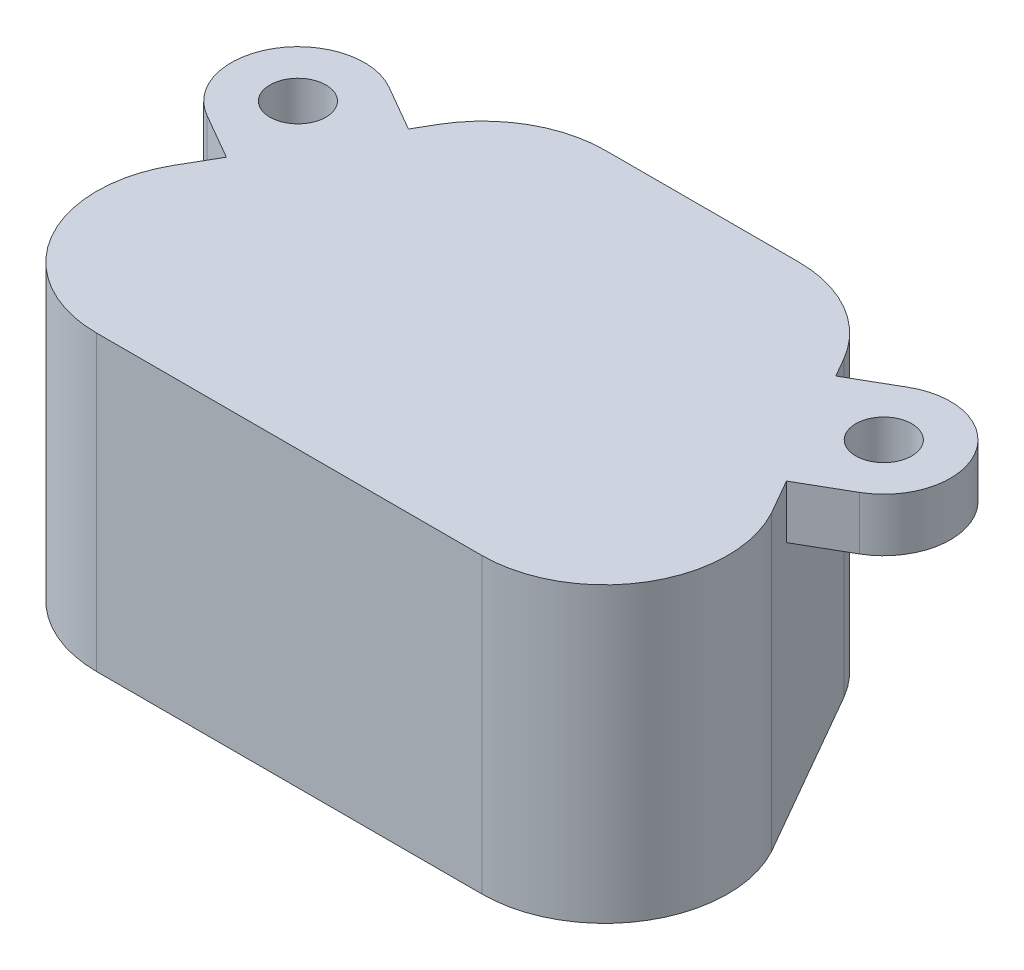
ISO-10303-21;
HEADER;
FILE_DESCRIPTION(('STEP AP214'),'2;1');
FILE_NAME('part.step','',(''),(''),'','','');
FILE_SCHEMA(('AUTOMOTIVE_DESIGN { 1 0 10303 214 1 1 1 1 }'));
ENDSEC;
DATA;
#1=APPLICATION_CONTEXT('core data for automotive mechanical design processes');
#2=APPLICATION_PROTOCOL_DEFINITION('international standard','automotive_design',2000,#1);
#3=PRODUCT_CONTEXT('',#1,'mechanical');
#4=PRODUCT('Part','Part','',(#3));
#5=PRODUCT_RELATED_PRODUCT_CATEGORY('part','',(#4));
#6=PRODUCT_DEFINITION_FORMATION('','',#4);
#7=PRODUCT_DEFINITION_CONTEXT('part definition',#1,'design');
#8=PRODUCT_DEFINITION('design','',#6,#7);
#9=PRODUCT_DEFINITION_SHAPE('','',#8);
#10=(LENGTH_UNIT() NAMED_UNIT(*) SI_UNIT(.MILLI.,.METRE.));
#11=(NAMED_UNIT(*) PLANE_ANGLE_UNIT() SI_UNIT($,.RADIAN.));
#12=(NAMED_UNIT(*) SI_UNIT($,.STERADIAN.) SOLID_ANGLE_UNIT());
#13=UNCERTAINTY_MEASURE_WITH_UNIT(LENGTH_MEASURE(1.E-05),#10,'distance_accuracy_value','');
#14=(GEOMETRIC_REPRESENTATION_CONTEXT(3) GLOBAL_UNCERTAINTY_ASSIGNED_CONTEXT((#13)) GLOBAL_UNIT_ASSIGNED_CONTEXT((#10,
#11,#12)) REPRESENTATION_CONTEXT('',''));
#15=CARTESIAN_POINT('',(0.,0.,0.));
#16=DIRECTION('',(0.,0.,1.));
#17=DIRECTION('',(1.,0.,0.));
#18=AXIS2_PLACEMENT_3D('',#15,#16,#17);
#19=CARTESIAN_POINT('',(-47.4216966637043,0.,0.730165567187122));
#20=DIRECTION('',(0.,1.,0.));
#21=DIRECTION('',(0.,0.,1.));
#22=AXIS2_PLACEMENT_3D('',#19,#20,#21);
#23=PLANE('',#22);
#24=CARTESIAN_POINT('',(-47.4216966637043,0.,0.730165567187122));
#25=DIRECTION('',(0.,1.,0.));
#26=DIRECTION('',(0.,0.,1.));
#27=AXIS2_PLACEMENT_3D('',#24,#25,#26);
#28=CIRCLE('',#27,9.22333333333335);
#29=CARTESIAN_POINT('',(-47.4216966637043,0.,-8.49316776614623));
#30=VERTEX_POINT('',#29);
#31=CARTESIAN_POINT('',(-55.3489808309486,0.,-3.98449704105281));
#32=VERTEX_POINT('',#31);
#33=EDGE_CURVE('E357',#30,#32,#28,.T.);
#34=ORIENTED_EDGE('',*,*,#33,.F.);
#35=DIRECTION('',(-1.,0.,0.));
#36=VECTOR('',#35,1.);
#37=CARTESIAN_POINT('',(-47.4216966637043,0.,-8.49316776614623));
#38=LINE('',#37,#36);
#39=CARTESIAN_POINT('',(-32.9216966637043,0.,-8.49316776614623));
#40=VERTEX_POINT('',#39);
#41=EDGE_CURVE('E372',#40,#30,#38,.T.);
#42=ORIENTED_EDGE('',*,*,#41,.F.);
#43=CARTESIAN_POINT('',(-32.9216966637043,0.,0.730165567187122));
#44=DIRECTION('',(0.,1.,0.));
#45=DIRECTION('',(0.,0.,-1.));
#46=AXIS2_PLACEMENT_3D('',#43,#44,#45);
#47=CIRCLE('',#46,9.22333333333335);
#48=CARTESIAN_POINT('',(-24.9330360805528,0.,-3.87973463400808));
#49=VERTEX_POINT('',#48);
#50=EDGE_CURVE('E370',#49,#40,#47,.T.);
#51=ORIENTED_EDGE('',*,*,#50,.F.);
#52=DIRECTION('',(-0.497445549195721,0.,-0.867495202053226));
#53=VECTOR('',#52,1.);
#54=CARTESIAN_POINT('',(-24.9330360805528,0.,-3.87973463400808));
#55=LINE('',#54,#53);
#56=CARTESIAN_POINT('',(-17.6364011451582,0.,8.84486569224452));
#57=VERTEX_POINT('',#56);
#58=EDGE_CURVE('E368',#57,#49,#55,.T.);
#59=ORIENTED_EDGE('',*,*,#58,.F.);
#60=CARTESIAN_POINT('',(-25.7453956916071,0.,13.2396450067768));
#61=DIRECTION('',(0.,1.,0.));
#62=DIRECTION('',(0.,0.,-1.));
#63=AXIS2_PLACEMENT_3D('',#60,#61,#62);
#64=CIRCLE('',#63,9.22333333333335);
#65=CARTESIAN_POINT('',(-25.7453956916071,0.,22.4629783401101));
#66=VERTEX_POINT('',#65);
#67=EDGE_CURVE('E366',#66,#57,#64,.T.);
#68=ORIENTED_EDGE('',*,*,#67,.F.);
#69=DIRECTION('',(1.,0.,0.));
#70=VECTOR('',#69,1.);
#71=CARTESIAN_POINT('',(-54.6453956916071,0.,22.4629783401101));
#72=LINE('',#71,#70);
#73=CARTESIAN_POINT('',(-54.6453956916071,0.,22.4629783401101));
#74=VERTEX_POINT('',#73);
#75=EDGE_CURVE('E364',#74,#66,#72,.T.);
#76=ORIENTED_EDGE('',*,*,#75,.F.);
#77=CARTESIAN_POINT('',(-54.6453956916071,0.,13.2396450067768));
#78=DIRECTION('',(0.,1.,0.));
#79=DIRECTION('',(0.,0.,1.));
#80=AXIS2_PLACEMENT_3D('',#77,#78,#79);
#81=CIRCLE('',#80,9.22333333333334);
#82=CARTESIAN_POINT('',(-62.6827532965693,0.,8.71518255166311));
#83=VERTEX_POINT('',#82);
#84=EDGE_CURVE('E362',#83,#74,#81,.T.);
#85=ORIENTED_EDGE('',*,*,#84,.F.);
#86=DIRECTION('',(-0.50008228651146,0.,0.865977890432239));
#87=VECTOR('',#86,1.);
#88=CARTESIAN_POINT('',(-55.3489808309486,0.,-3.98449704105281));
#89=LINE('',#88,#87);
#90=EDGE_CURVE('E360',#32,#83,#89,.T.);
#91=ORIENTED_EDGE('',*,*,#90,.F.);
#92=EDGE_LOOP('',(#34,#42,#51,#59,#68,#76,#85,#91));
#93=FACE_BOUND('',#92,.T.);
#94=CARTESIAN_POINT('',(-54.6453956916071,0.,13.2396450067768));
#95=DIRECTION('',(0.,1.,0.));
#96=DIRECTION('',(0.,0.,1.));
#97=AXIS2_PLACEMENT_3D('',#94,#95,#96);
#98=CIRCLE('',#97,7.22333333333334);
#99=CARTESIAN_POINT('',(-60.9449722688829,0.,9.70525971489323));
#100=VERTEX_POINT('',#99);
#101=CARTESIAN_POINT('',(-54.6453956916071,0.,20.4629783401101));
#102=VERTEX_POINT('',#101);
#103=EDGE_CURVE('E291',#100,#102,#98,.T.);
#104=ORIENTED_EDGE('',*,*,#103,.T.);
#105=DIRECTION('',(1.,0.,0.));
#106=VECTOR('',#105,1.);
#107=CARTESIAN_POINT('',(-54.6453956916071,0.,20.4629783401101));
#108=LINE('',#107,#106);
#109=CARTESIAN_POINT('',(-25.7453956916071,0.,20.4629783401101));
#110=VERTEX_POINT('',#109);
#111=EDGE_CURVE('E320',#102,#110,#108,.T.);
#112=ORIENTED_EDGE('',*,*,#111,.T.);
#113=CARTESIAN_POINT('',(-25.7453956916071,0.,13.2396450067768));
#114=DIRECTION('',(0.,1.,0.));
#115=DIRECTION('',(0.,0.,-1.));
#116=AXIS2_PLACEMENT_3D('',#113,#114,#115);
#117=CIRCLE('',#116,7.22333333333334);
#118=CARTESIAN_POINT('',(-19.3840592628784,0.,9.81766556718711));
#119=VERTEX_POINT('',#118);
#120=EDGE_CURVE('E323',#110,#119,#117,.T.);
#121=ORIENTED_EDGE('',*,*,#120,.T.);
#122=DIRECTION('',(-0.497445549195721,0.,-0.867495202053226));
#123=VECTOR('',#122,1.);
#124=CARTESIAN_POINT('',(-26.6665876962726,0.,-2.88233443281289));
#125=LINE('',#124,#123);
#126=CARTESIAN_POINT('',(-26.6665876962726,0.,-2.88233443281289));
#127=VERTEX_POINT('',#126);
#128=EDGE_CURVE('E326',#119,#127,#125,.T.);
#129=ORIENTED_EDGE('',*,*,#128,.T.);
#130=CARTESIAN_POINT('',(-32.9216966637043,0.,0.730165567187122));
#131=DIRECTION('',(0.,1.,0.));
#132=DIRECTION('',(0.,0.,-1.));
#133=AXIS2_PLACEMENT_3D('',#130,#131,#132);
#134=CIRCLE('',#133,7.22333333333335);
#135=CARTESIAN_POINT('',(-32.9216966637043,0.,-6.49316776614623));
#136=VERTEX_POINT('',#135);
#137=EDGE_CURVE('E329',#127,#136,#134,.T.);
#138=ORIENTED_EDGE('',*,*,#137,.T.);
#139=DIRECTION('',(-1.,0.,0.));
#140=VECTOR('',#139,1.);
#141=CARTESIAN_POINT('',(-47.4216966637043,0.,-6.49316776614623));
#142=LINE('',#141,#140);
#143=CARTESIAN_POINT('',(-47.4216966637043,0.,-6.49316776614623));
#144=VERTEX_POINT('',#143);
#145=EDGE_CURVE('E332',#136,#144,#142,.T.);
#146=ORIENTED_EDGE('',*,*,#145,.T.);
#147=CARTESIAN_POINT('',(-47.4216966637043,0.,0.730165567187122));
#148=DIRECTION('',(0.,1.,0.));
#149=DIRECTION('',(0.,0.,1.));
#150=AXIS2_PLACEMENT_3D('',#147,#148,#149);
#151=CIRCLE('',#150,7.22333333333335);
#152=CARTESIAN_POINT('',(-53.6238423955838,0.,-2.9725270699317));
#153=VERTEX_POINT('',#152);
#154=EDGE_CURVE('E335',#144,#153,#151,.T.);
#155=ORIENTED_EDGE('',*,*,#154,.T.);
#156=DIRECTION('',(-0.50008228651146,0.,0.865977890432238));
#157=VECTOR('',#156,1.);
#158=CARTESIAN_POINT('',(-53.6238423955838,0.,-2.9725270699317));
#159=LINE('',#158,#157);
#160=EDGE_CURVE('E296',#153,#100,#159,.T.);
#161=ORIENTED_EDGE('',*,*,#160,.T.);
#162=EDGE_LOOP('',(#104,#112,#121,#129,#138,#146,#155,#161));
#163=FACE_BOUND('',#162,.T.);
#164=ADVANCED_FACE('F33',(#93,#163),#23,.F.);
#165=CARTESIAN_POINT('',(-47.4216966637043,20.,0.730165567187122));
#166=DIRECTION('',(0.,-1.,0.));
#167=DIRECTION('',(0.,0.,-1.));
#168=AXIS2_PLACEMENT_3D('',#165,#166,#167);
#169=CYLINDRICAL_SURFACE('',#168,9.22333333333335);
#170=ORIENTED_EDGE('',*,*,#33,.T.);
#171=DIRECTION('',(0.,-1.,0.));
#172=VECTOR('',#171,1.);
#173=CARTESIAN_POINT('',(-55.3489808309486,20.,-3.98449704105281));
#174=LINE('',#173,#172);
#175=CARTESIAN_POINT('',(-55.3489808309486,22.,-3.98449704105281));
#176=VERTEX_POINT('',#175);
#177=EDGE_CURVE('E41',#176,#32,#174,.T.);
#178=ORIENTED_EDGE('',*,*,#177,.F.);
#179=CARTESIAN_POINT('',(-47.4216966637043,22.,0.730165567187122));
#180=DIRECTION('',(0.,1.,0.));
#181=DIRECTION('',(0.,0.,1.));
#182=AXIS2_PLACEMENT_3D('',#179,#180,#181);
#183=CIRCLE('',#182,9.22333333333335);
#184=CARTESIAN_POINT('',(-47.4216966637043,22.,-8.49316776614623));
#185=VERTEX_POINT('',#184);
#186=EDGE_CURVE('E265',#185,#176,#183,.T.);
#187=ORIENTED_EDGE('',*,*,#186,.F.);
#188=DIRECTION('',(0.,-1.,0.));
#189=VECTOR('',#188,1.);
#190=CARTESIAN_POINT('',(-47.4216966637043,20.,-8.49316776614623));
#191=LINE('',#190,#189);
#192=EDGE_CURVE('E374',#185,#30,#191,.T.);
#193=ORIENTED_EDGE('',*,*,#192,.T.);
#194=EDGE_LOOP('',(#170,#178,#187,#193));
#195=FACE_BOUND('',#194,.T.);
#196=ADVANCED_FACE('F35',(#195),#169,.T.);
#197=CARTESIAN_POINT('',(-55.3489808309486,20.,-3.98449704105281));
#198=DIRECTION('',(0.865977890432239,0.,0.50008228651146));
#199=DIRECTION('',(0.50008228651146,0.,-0.865977890432239));
#200=AXIS2_PLACEMENT_3D('',#197,#198,#199);
#201=PLANE('',#200);
#202=DIRECTION('',(0.500082286470148,0.,-0.865977890456095));
#203=VECTOR('',#202,1.);
#204=CARTESIAN_POINT('',(-61.2110120035,18.,6.16661113841472));
#205=LINE('',#204,#203);
#206=CARTESIAN_POINT('',(-61.2110120035,18.,6.16661113841472));
#207=VERTEX_POINT('',#206);
#208=CARTESIAN_POINT('',(-56.2101891387985,18.,-2.49316776614623));
#209=VERTEX_POINT('',#208);
#210=EDGE_CURVE('E212',#207,#209,#205,.T.);
#211=ORIENTED_EDGE('',*,*,#210,.T.);
#212=DIRECTION('',(0.,1.,0.));
#213=VECTOR('',#212,1.);
#214=CARTESIAN_POINT('',(-56.2101891387985,18.,-2.49316776614623));
#215=LINE('',#214,#213);
#216=CARTESIAN_POINT('',(-56.2101891387985,22.,-2.49316776614623));
#217=VERTEX_POINT('',#216);
#218=EDGE_CURVE('E232',#209,#217,#215,.T.);
#219=ORIENTED_EDGE('',*,*,#218,.T.);
#220=DIRECTION('',(-0.500082286511459,0.,0.865977890432239));
#221=VECTOR('',#220,1.);
#222=CARTESIAN_POINT('',(-55.3489808309486,22.,-3.98449704105281));
#223=LINE('',#222,#221);
#224=EDGE_CURVE('E269',#176,#217,#223,.T.);
#225=ORIENTED_EDGE('',*,*,#224,.F.);
#226=ORIENTED_EDGE('',*,*,#177,.T.);
#227=ORIENTED_EDGE('',*,*,#90,.T.);
#228=DIRECTION('',(0.,-1.,0.));
#229=VECTOR('',#228,1.);
#230=CARTESIAN_POINT('',(-62.6827532965693,20.,8.71518255166311));
#231=LINE('',#230,#229);
#232=CARTESIAN_POINT('',(-62.6827532959597,22.,8.71518255200631));
#233=VERTEX_POINT('',#232);
#234=EDGE_CURVE('E392',#233,#83,#231,.T.);
#235=ORIENTED_EDGE('',*,*,#234,.F.);
#236=CARTESIAN_POINT('',(-61.2110120039843,22.,6.16661113813507));
#237=VERTEX_POINT('',#236);
#238=EDGE_CURVE('E268',#237,#233,#223,.T.);
#239=ORIENTED_EDGE('',*,*,#238,.F.);
#240=DIRECTION('',(0.,1.,0.));
#241=VECTOR('',#240,1.);
#242=CARTESIAN_POINT('',(-61.2110120035,18.,6.16661113841472));
#243=LINE('',#242,#241);
#244=EDGE_CURVE('E202',#207,#237,#243,.T.);
#245=ORIENTED_EDGE('',*,*,#244,.F.);
#246=EDGE_LOOP('',(#211,#219,#225,#226,#227,#235,#239,#245));
#247=FACE_BOUND('',#246,.T.);
#248=ADVANCED_FACE('F397',(#247),#201,.F.);
#249=CARTESIAN_POINT('',(-54.6453956916071,20.,13.2396450067768));
#250=DIRECTION('',(0.,-1.,0.));
#251=DIRECTION('',(0.,0.,-1.));
#252=AXIS2_PLACEMENT_3D('',#249,#250,#251);
#253=CYLINDRICAL_SURFACE('',#252,9.22333333333334);
#254=ORIENTED_EDGE('',*,*,#84,.T.);
#255=DIRECTION('',(0.,-1.,0.));
#256=VECTOR('',#255,1.);
#257=CARTESIAN_POINT('',(-54.6453956916071,20.,22.4629783401101));
#258=LINE('',#257,#256);
#259=CARTESIAN_POINT('',(-54.6453956916071,22.,22.4629783387108));
#260=VERTEX_POINT('',#259);
#261=EDGE_CURVE('E389',#260,#74,#258,.T.);
#262=ORIENTED_EDGE('',*,*,#261,.F.);
#263=CARTESIAN_POINT('',(-54.6453956916071,22.,13.2396450067768));
#264=DIRECTION('',(0.,1.,0.));
#265=DIRECTION('',(0.,0.,1.));
#266=AXIS2_PLACEMENT_3D('',#263,#264,#265);
#267=CIRCLE('',#266,9.22333333263371);
#268=EDGE_CURVE('E272',#233,#260,#267,.T.);
#269=ORIENTED_EDGE('',*,*,#268,.F.);
#270=ORIENTED_EDGE('',*,*,#234,.T.);
#271=EDGE_LOOP('',(#254,#262,#269,#270));
#272=FACE_BOUND('',#271,.T.);
#273=ADVANCED_FACE('F410',(#272),#253,.T.);
#274=CARTESIAN_POINT('',(-54.6453956916071,20.,22.4629783401101));
#275=DIRECTION('',(0.,0.,-1.));
#276=DIRECTION('',(-1.,0.,0.));
#277=AXIS2_PLACEMENT_3D('',#274,#275,#276);
#278=PLANE('',#277);
#279=ORIENTED_EDGE('',*,*,#75,.T.);
#280=DIRECTION('',(0.,-1.,0.));
#281=VECTOR('',#280,1.);
#282=CARTESIAN_POINT('',(-25.7453956916071,20.,22.4629783401101));
#283=LINE('',#282,#281);
#284=CARTESIAN_POINT('',(-25.7453956916071,22.,22.4629783401101));
#285=VERTEX_POINT('',#284);
#286=EDGE_CURVE('E386',#285,#66,#283,.T.);
#287=ORIENTED_EDGE('',*,*,#286,.F.);
#288=DIRECTION('',(1.,0.,4.8417872940492E-11));
#289=VECTOR('',#288,1.);
#290=CARTESIAN_POINT('',(-54.6453956916071,22.,22.4629783387108));
#291=LINE('',#290,#289);
#292=EDGE_CURVE('E275',#260,#285,#291,.T.);
#293=ORIENTED_EDGE('',*,*,#292,.F.);
#294=ORIENTED_EDGE('',*,*,#261,.T.);
#295=EDGE_LOOP('',(#279,#287,#293,#294));
#296=FACE_BOUND('',#295,.T.);
#297=ADVANCED_FACE('F414',(#296),#278,.F.);
#298=CARTESIAN_POINT('',(-25.7453956916071,20.,13.2396450067768));
#299=DIRECTION('',(0.,-1.,0.));
#300=DIRECTION('',(0.,0.,-1.));
#301=AXIS2_PLACEMENT_3D('',#298,#299,#300);
#302=CYLINDRICAL_SURFACE('',#301,9.22333333333335);
#303=ORIENTED_EDGE('',*,*,#67,.T.);
#304=DIRECTION('',(0.,-1.,0.));
#305=VECTOR('',#304,1.);
#306=CARTESIAN_POINT('',(-17.6364011451582,20.,8.84486569224452));
#307=LINE('',#306,#305);
#308=CARTESIAN_POINT('',(-17.6364011451582,22.,8.84486569224452));
#309=VERTEX_POINT('',#308);
#310=EDGE_CURVE('E383',#309,#57,#307,.T.);
#311=ORIENTED_EDGE('',*,*,#310,.F.);
#312=CARTESIAN_POINT('',(-25.7453956916071,22.,13.2396450067768));
#313=DIRECTION('',(0.,1.,0.));
#314=DIRECTION('',(0.,0.,1.));
#315=AXIS2_PLACEMENT_3D('',#312,#313,#314);
#316=CIRCLE('',#315,9.22333333333335);
#317=EDGE_CURVE('E278',#285,#309,#316,.T.);
#318=ORIENTED_EDGE('',*,*,#317,.F.);
#319=ORIENTED_EDGE('',*,*,#286,.T.);
#320=EDGE_LOOP('',(#303,#311,#318,#319));
#321=FACE_BOUND('',#320,.T.);
#322=ADVANCED_FACE('F420',(#321),#302,.T.);
#323=CARTESIAN_POINT('',(-24.9330360805528,20.,-3.87973463400808));
#324=DIRECTION('',(-0.867495202053226,0.,0.497445549195721));
#325=DIRECTION('',(0.497445549195721,0.,0.867495202053226));
#326=AXIS2_PLACEMENT_3D('',#323,#324,#325);
#327=PLANE('',#326);
#328=DIRECTION('',(0.497445549195721,0.,0.867495202053226));
#329=VECTOR('',#328,1.);
#330=CARTESIAN_POINT('',(-24.9330360805528,18.,-3.87973463400808));
#331=LINE('',#330,#329);
#332=CARTESIAN_POINT('',(-24.128464476547,18.,-2.47664236127243));
#333=VERTEX_POINT('',#332);
#334=CARTESIAN_POINT('',(-19.1540033058954,18.,6.19831956233408));
#335=VERTEX_POINT('',#334);
#336=EDGE_CURVE('E11',#333,#335,#331,.T.);
#337=ORIENTED_EDGE('',*,*,#336,.T.);
#338=DIRECTION('',(0.,1.,0.));
#339=VECTOR('',#338,1.);
#340=CARTESIAN_POINT('',(-19.1540033058954,20.,6.19831956233408));
#341=LINE('',#340,#339);
#342=CARTESIAN_POINT('',(-19.1540033058954,22.,6.19831956233408));
#343=VERTEX_POINT('',#342);
#344=EDGE_CURVE('E262',#335,#343,#341,.T.);
#345=ORIENTED_EDGE('',*,*,#344,.T.);
#346=DIRECTION('',(-0.497445549195721,0.,-0.867495202053226));
#347=VECTOR('',#346,1.);
#348=CARTESIAN_POINT('',(-17.6364011451582,22.,8.84486569224452));
#349=LINE('',#348,#347);
#350=EDGE_CURVE('E282',#309,#343,#349,.T.);
#351=ORIENTED_EDGE('',*,*,#350,.F.);
#352=ORIENTED_EDGE('',*,*,#310,.T.);
#353=ORIENTED_EDGE('',*,*,#58,.T.);
#354=DIRECTION('',(0.,-1.,0.));
#355=VECTOR('',#354,1.);
#356=CARTESIAN_POINT('',(-24.9330360805528,20.,-3.87973463400808));
#357=LINE('',#356,#355);
#358=CARTESIAN_POINT('',(-24.9330360805528,22.,-3.87973463400808));
#359=VERTEX_POINT('',#358);
#360=EDGE_CURVE('E380',#359,#49,#357,.T.);
#361=ORIENTED_EDGE('',*,*,#360,.F.);
#362=CARTESIAN_POINT('',(-24.128464476547,22.,-2.47664236127243));
#363=VERTEX_POINT('',#362);
#364=EDGE_CURVE('E281',#363,#359,#349,.T.);
#365=ORIENTED_EDGE('',*,*,#364,.F.);
#366=DIRECTION('',(0.,-1.,0.));
#367=VECTOR('',#366,1.);
#368=CARTESIAN_POINT('',(-24.128464476547,20.,-2.47664236127243));
#369=LINE('',#368,#367);
#370=EDGE_CURVE('E258',#363,#333,#369,.T.);
#371=ORIENTED_EDGE('',*,*,#370,.T.);
#372=EDGE_LOOP('',(#337,#345,#351,#352,#353,#361,#365,#371));
#373=FACE_BOUND('',#372,.T.);
#374=ADVANCED_FACE('F423',(#373),#327,.F.);
#375=CARTESIAN_POINT('',(-32.9216966637043,20.,0.730165567187122));
#376=DIRECTION('',(0.,-1.,0.));
#377=DIRECTION('',(0.,0.,-1.));
#378=AXIS2_PLACEMENT_3D('',#375,#376,#377);
#379=CYLINDRICAL_SURFACE('',#378,9.22333333333335);
#380=ORIENTED_EDGE('',*,*,#50,.T.);
#381=DIRECTION('',(0.,-1.,0.));
#382=VECTOR('',#381,1.);
#383=CARTESIAN_POINT('',(-32.9216966637043,20.,-8.49316776614623));
#384=LINE('',#383,#382);
#385=CARTESIAN_POINT('',(-32.9216966637043,22.,-8.49316776614623));
#386=VERTEX_POINT('',#385);
#387=EDGE_CURVE('E377',#386,#40,#384,.T.);
#388=ORIENTED_EDGE('',*,*,#387,.F.);
#389=CARTESIAN_POINT('',(-32.9216966637043,22.,0.730165567187122));
#390=DIRECTION('',(0.,1.,0.));
#391=DIRECTION('',(0.,0.,1.));
#392=AXIS2_PLACEMENT_3D('',#389,#390,#391);
#393=CIRCLE('',#392,9.22333333333335);
#394=EDGE_CURVE('E285',#359,#386,#393,.T.);
#395=ORIENTED_EDGE('',*,*,#394,.F.);
#396=ORIENTED_EDGE('',*,*,#360,.T.);
#397=EDGE_LOOP('',(#380,#388,#395,#396));
#398=FACE_BOUND('',#397,.T.);
#399=ADVANCED_FACE('F426',(#398),#379,.T.);
#400=CARTESIAN_POINT('',(-47.4216966637043,20.,-8.49316776614623));
#401=DIRECTION('',(0.,0.,1.));
#402=DIRECTION('',(1.,0.,0.));
#403=AXIS2_PLACEMENT_3D('',#400,#401,#402);
#404=PLANE('',#403);
#405=ORIENTED_EDGE('',*,*,#41,.T.);
#406=ORIENTED_EDGE('',*,*,#192,.F.);
#407=DIRECTION('',(-1.,0.,0.));
#408=VECTOR('',#407,1.);
#409=CARTESIAN_POINT('',(-32.9216966637043,22.,-8.49316776614623));
#410=LINE('',#409,#408);
#411=EDGE_CURVE('E288',#386,#185,#410,.T.);
#412=ORIENTED_EDGE('',*,*,#411,.F.);
#413=ORIENTED_EDGE('',*,*,#387,.T.);
#414=EDGE_LOOP('',(#405,#406,#412,#413));
#415=FACE_BOUND('',#414,.T.);
#416=ADVANCED_FACE('F430',(#415),#404,.F.);
#417=CARTESIAN_POINT('',(-54.6453956916071,20.,13.2396450067768));
#418=DIRECTION('',(0.,-1.,0.));
#419=DIRECTION('',(0.,0.,-1.));
#420=AXIS2_PLACEMENT_3D('',#417,#418,#419);
#421=CYLINDRICAL_SURFACE('',#420,7.22333333333334);
#422=ORIENTED_EDGE('',*,*,#103,.F.);
#423=DIRECTION('',(0.,-1.,0.));
#424=VECTOR('',#423,1.);
#425=CARTESIAN_POINT('',(-60.9449722688829,20.,9.70525971489323));
#426=LINE('',#425,#424);
#427=CARTESIAN_POINT('',(-60.9449722688829,20.,9.70525971489323));
#428=VERTEX_POINT('',#427);
#429=EDGE_CURVE('E317',#428,#100,#426,.T.);
#430=ORIENTED_EDGE('',*,*,#429,.F.);
#431=CARTESIAN_POINT('',(-54.6453956916071,20.,13.2396450067768));
#432=DIRECTION('',(0.,1.,0.));
#433=DIRECTION('',(0.,0.,1.));
#434=AXIS2_PLACEMENT_3D('',#431,#432,#433);
#435=CIRCLE('',#434,7.22333333333334);
#436=CARTESIAN_POINT('',(-54.6453956916071,20.,20.4629783401101));
#437=VERTEX_POINT('',#436);
#438=EDGE_CURVE('E292',#428,#437,#435,.T.);
#439=ORIENTED_EDGE('',*,*,#438,.T.);
#440=DIRECTION('',(0.,-1.,0.));
#441=VECTOR('',#440,1.);
#442=CARTESIAN_POINT('',(-54.6453956916071,20.,20.4629783401101));
#443=LINE('',#442,#441);
#444=EDGE_CURVE('E354',#437,#102,#443,.T.);
#445=ORIENTED_EDGE('',*,*,#444,.T.);
#446=EDGE_LOOP('',(#422,#430,#439,#445));
#447=FACE_BOUND('',#446,.T.);
#448=ADVANCED_FACE('F461',(#447),#421,.F.);
#449=CARTESIAN_POINT('',(-54.6453956916071,20.,20.4629783401101));
#450=DIRECTION('',(0.,0.,-1.));
#451=DIRECTION('',(-1.,0.,0.));
#452=AXIS2_PLACEMENT_3D('',#449,#450,#451);
#453=PLANE('',#452);
#454=ORIENTED_EDGE('',*,*,#111,.F.);
#455=ORIENTED_EDGE('',*,*,#444,.F.);
#456=DIRECTION('',(1.,0.,0.));
#457=VECTOR('',#456,1.);
#458=CARTESIAN_POINT('',(-54.6453956916071,20.,20.4629783401101));
#459=LINE('',#458,#457);
#460=CARTESIAN_POINT('',(-25.7453956916071,20.,20.4629783401101));
#461=VERTEX_POINT('',#460);
#462=EDGE_CURVE('E295',#437,#461,#459,.T.);
#463=ORIENTED_EDGE('',*,*,#462,.T.);
#464=DIRECTION('',(0.,-1.,0.));
#465=VECTOR('',#464,1.);
#466=CARTESIAN_POINT('',(-25.7453956916071,20.,20.4629783401101));
#467=LINE('',#466,#465);
#468=EDGE_CURVE('E352',#461,#110,#467,.T.);
#469=ORIENTED_EDGE('',*,*,#468,.T.);
#470=EDGE_LOOP('',(#454,#455,#463,#469));
#471=FACE_BOUND('',#470,.T.);
#472=ADVANCED_FACE('F511',(#471),#453,.T.);
#473=CARTESIAN_POINT('',(-25.7453956916071,20.,13.2396450067768));
#474=DIRECTION('',(0.,-1.,0.));
#475=DIRECTION('',(0.,0.,-1.));
#476=AXIS2_PLACEMENT_3D('',#473,#474,#475);
#477=CYLINDRICAL_SURFACE('',#476,7.22333333333334);
#478=ORIENTED_EDGE('',*,*,#120,.F.);
#479=ORIENTED_EDGE('',*,*,#468,.F.);
#480=CARTESIAN_POINT('',(-25.7453956916071,20.,13.2396450067768));
#481=DIRECTION('',(0.,1.,0.));
#482=DIRECTION('',(0.,0.,-1.));
#483=AXIS2_PLACEMENT_3D('',#480,#481,#482);
#484=CIRCLE('',#483,7.22333333333334);
#485=CARTESIAN_POINT('',(-19.3840592628784,20.,9.81766556718711));
#486=VERTEX_POINT('',#485);
#487=EDGE_CURVE('E299',#461,#486,#484,.T.);
#488=ORIENTED_EDGE('',*,*,#487,.T.);
#489=DIRECTION('',(0.,-1.,0.));
#490=VECTOR('',#489,1.);
#491=CARTESIAN_POINT('',(-19.3840592628784,20.,9.81766556718711));
#492=LINE('',#491,#490);
#493=EDGE_CURVE('E350',#486,#119,#492,.T.);
#494=ORIENTED_EDGE('',*,*,#493,.T.);
#495=EDGE_LOOP('',(#478,#479,#488,#494));
#496=FACE_BOUND('',#495,.T.);
#497=ADVANCED_FACE('F518',(#496),#477,.F.);
#498=CARTESIAN_POINT('',(-26.6665876962726,20.,-2.88233443281289));
#499=DIRECTION('',(-0.867495202053226,0.,0.497445549195721));
#500=DIRECTION('',(0.497445549195721,0.,0.867495202053226));
#501=AXIS2_PLACEMENT_3D('',#498,#499,#500);
#502=PLANE('',#501);
#503=ORIENTED_EDGE('',*,*,#128,.F.);
#504=ORIENTED_EDGE('',*,*,#493,.F.);
#505=DIRECTION('',(-0.497445549195721,0.,-0.867495202053226));
#506=VECTOR('',#505,1.);
#507=CARTESIAN_POINT('',(-26.6665876962726,20.,-2.88233443281289));
#508=LINE('',#507,#506);
#509=CARTESIAN_POINT('',(-26.6665876962726,20.,-2.88233443281289));
#510=VERTEX_POINT('',#509);
#511=EDGE_CURVE('E302',#486,#510,#508,.T.);
#512=ORIENTED_EDGE('',*,*,#511,.T.);
#513=DIRECTION('',(0.,-1.,0.));
#514=VECTOR('',#513,1.);
#515=CARTESIAN_POINT('',(-26.6665876962726,20.,-2.88233443281289));
#516=LINE('',#515,#514);
#517=EDGE_CURVE('E348',#510,#127,#516,.T.);
#518=ORIENTED_EDGE('',*,*,#517,.T.);
#519=EDGE_LOOP('',(#503,#504,#512,#518));
#520=FACE_BOUND('',#519,.T.);
#521=ADVANCED_FACE('F525',(#520),#502,.T.);
#522=CARTESIAN_POINT('',(-32.9216966637043,20.,0.730165567187122));
#523=DIRECTION('',(0.,-1.,0.));
#524=DIRECTION('',(0.,0.,-1.));
#525=AXIS2_PLACEMENT_3D('',#522,#523,#524);
#526=CYLINDRICAL_SURFACE('',#525,7.22333333333335);
#527=ORIENTED_EDGE('',*,*,#137,.F.);
#528=ORIENTED_EDGE('',*,*,#517,.F.);
#529=CARTESIAN_POINT('',(-32.9216966637043,20.,0.730165567187122));
#530=DIRECTION('',(0.,1.,0.));
#531=DIRECTION('',(0.,0.,-1.));
#532=AXIS2_PLACEMENT_3D('',#529,#530,#531);
#533=CIRCLE('',#532,7.22333333333335);
#534=CARTESIAN_POINT('',(-32.9216966637043,20.,-6.49316776614623));
#535=VERTEX_POINT('',#534);
#536=EDGE_CURVE('E305',#510,#535,#533,.T.);
#537=ORIENTED_EDGE('',*,*,#536,.T.);
#538=DIRECTION('',(0.,-1.,0.));
#539=VECTOR('',#538,1.);
#540=CARTESIAN_POINT('',(-32.9216966637043,20.,-6.49316776614623));
#541=LINE('',#540,#539);
#542=EDGE_CURVE('E346',#535,#136,#541,.T.);
#543=ORIENTED_EDGE('',*,*,#542,.T.);
#544=EDGE_LOOP('',(#527,#528,#537,#543));
#545=FACE_BOUND('',#544,.T.);
#546=ADVANCED_FACE('F533',(#545),#526,.F.);
#547=CARTESIAN_POINT('',(-47.4216966637043,20.,-6.49316776614623));
#548=DIRECTION('',(0.,0.,1.));
#549=DIRECTION('',(1.,0.,0.));
#550=AXIS2_PLACEMENT_3D('',#547,#548,#549);
#551=PLANE('',#550);
#552=ORIENTED_EDGE('',*,*,#145,.F.);
#553=ORIENTED_EDGE('',*,*,#542,.F.);
#554=DIRECTION('',(-1.,0.,0.));
#555=VECTOR('',#554,1.);
#556=CARTESIAN_POINT('',(-47.4216966637043,20.,-6.49316776614623));
#557=LINE('',#556,#555);
#558=CARTESIAN_POINT('',(-47.4216966637043,20.,-6.49316776614623));
#559=VERTEX_POINT('',#558);
#560=EDGE_CURVE('E308',#535,#559,#557,.T.);
#561=ORIENTED_EDGE('',*,*,#560,.T.);
#562=DIRECTION('',(0.,-1.,0.));
#563=VECTOR('',#562,1.);
#564=CARTESIAN_POINT('',(-47.4216966637043,20.,-6.49316776614623));
#565=LINE('',#564,#563);
#566=EDGE_CURVE('E344',#559,#144,#565,.T.);
#567=ORIENTED_EDGE('',*,*,#566,.T.);
#568=EDGE_LOOP('',(#552,#553,#561,#567));
#569=FACE_BOUND('',#568,.T.);
#570=ADVANCED_FACE('F541',(#569),#551,.T.);
#571=CARTESIAN_POINT('',(-47.4216966637043,20.,0.730165567187122));
#572=DIRECTION('',(0.,-1.,0.));
#573=DIRECTION('',(0.,0.,-1.));
#574=AXIS2_PLACEMENT_3D('',#571,#572,#573);
#575=CYLINDRICAL_SURFACE('',#574,7.22333333333335);
#576=ORIENTED_EDGE('',*,*,#154,.F.);
#577=ORIENTED_EDGE('',*,*,#566,.F.);
#578=CARTESIAN_POINT('',(-47.4216966637043,20.,0.730165567187122));
#579=DIRECTION('',(0.,1.,0.));
#580=DIRECTION('',(0.,0.,1.));
#581=AXIS2_PLACEMENT_3D('',#578,#579,#580);
#582=CIRCLE('',#581,7.22333333333335);
#583=CARTESIAN_POINT('',(-53.6238423955838,20.,-2.9725270699317));
#584=VERTEX_POINT('',#583);
#585=EDGE_CURVE('E311',#559,#584,#582,.T.);
#586=ORIENTED_EDGE('',*,*,#585,.T.);
#587=DIRECTION('',(0.,-1.,0.));
#588=VECTOR('',#587,1.);
#589=CARTESIAN_POINT('',(-53.6238423955838,20.,-2.9725270699317));
#590=LINE('',#589,#588);
#591=EDGE_CURVE('E342',#584,#153,#590,.T.);
#592=ORIENTED_EDGE('',*,*,#591,.T.);
#593=EDGE_LOOP('',(#576,#577,#586,#592));
#594=FACE_BOUND('',#593,.T.);
#595=ADVANCED_FACE('F549',(#594),#575,.F.);
#596=CARTESIAN_POINT('',(-53.6238423955838,20.,-2.9725270699317));
#597=DIRECTION('',(0.865977890432238,0.,0.50008228651146));
#598=DIRECTION('',(0.50008228651146,0.,-0.865977890432238));
#599=AXIS2_PLACEMENT_3D('',#596,#597,#598);
#600=PLANE('',#599);
#601=ORIENTED_EDGE('',*,*,#160,.F.);
#602=ORIENTED_EDGE('',*,*,#591,.F.);
#603=DIRECTION('',(-0.50008228651146,0.,0.865977890432238));
#604=VECTOR('',#603,1.);
#605=CARTESIAN_POINT('',(-53.6238423955838,20.,-2.9725270699317));
#606=LINE('',#605,#604);
#607=EDGE_CURVE('E314',#584,#428,#606,.T.);
#608=ORIENTED_EDGE('',*,*,#607,.T.);
#609=ORIENTED_EDGE('',*,*,#429,.T.);
#610=EDGE_LOOP('',(#601,#602,#608,#609));
#611=FACE_BOUND('',#610,.T.);
#612=ADVANCED_FACE('F557',(#611),#600,.T.);
#613=CARTESIAN_POINT('',(-47.4216966637043,20.,0.730165567187122));
#614=DIRECTION('',(0.,1.,0.));
#615=DIRECTION('',(0.,0.,1.));
#616=AXIS2_PLACEMENT_3D('',#613,#614,#615);
#617=PLANE('',#616);
#618=ORIENTED_EDGE('',*,*,#462,.F.);
#619=ORIENTED_EDGE('',*,*,#438,.F.);
#620=ORIENTED_EDGE('',*,*,#607,.F.);
#621=ORIENTED_EDGE('',*,*,#585,.F.);
#622=ORIENTED_EDGE('',*,*,#560,.F.);
#623=ORIENTED_EDGE('',*,*,#536,.F.);
#624=ORIENTED_EDGE('',*,*,#511,.F.);
#625=ORIENTED_EDGE('',*,*,#487,.F.);
#626=EDGE_LOOP('',(#618,#619,#620,#621,#622,#623,#624,#625));
#627=FACE_BOUND('',#626,.T.);
#628=ADVANCED_FACE('F565',(#627),#617,.F.);
#629=CARTESIAN_POINT('',(-47.4216966637043,22.,0.730165567187122));
#630=DIRECTION('',(0.,1.,0.));
#631=DIRECTION('',(0.,0.,1.));
#632=AXIS2_PLACEMENT_3D('',#629,#630,#631);
#633=PLANE('',#632);
#634=ORIENTED_EDGE('',*,*,#350,.T.);
#635=DIRECTION('',(0.866742568685939,0.,-0.498755771523198));
#636=VECTOR('',#635,1.);
#637=CARTESIAN_POINT('',(-15.6878818066704,22.,4.20378489310692));
#638=LINE('',#637,#636);
#639=CARTESIAN_POINT('',(-15.6878818066704,22.,4.20378489310692));
#640=VERTEX_POINT('',#639);
#641=EDGE_CURVE('E246',#343,#640,#638,.T.);
#642=ORIENTED_EDGE('',*,*,#641,.T.);
#643=CARTESIAN_POINT('',(-18.1816606642864,22.,-0.129927950322773));
#644=DIRECTION('',(0.,1.,0.));
#645=DIRECTION('',(0.,0.,-1.));
#646=AXIS2_PLACEMENT_3D('',#643,#644,#645);
#647=CIRCLE('',#646,5.);
#648=CARTESIAN_POINT('',(-20.6754395219023,22.,-4.46364079375246));
#649=VERTEX_POINT('',#648);
#650=EDGE_CURVE('E239',#640,#649,#647,.T.);
#651=ORIENTED_EDGE('',*,*,#650,.T.);
#652=DIRECTION('',(-0.866742568685938,0.,0.498755771523199));
#653=VECTOR('',#652,1.);
#654=CARTESIAN_POINT('',(-20.6754395219023,22.,-4.46364079375246));
#655=LINE('',#654,#653);
#656=EDGE_CURVE('E55',#649,#363,#655,.T.);
#657=ORIENTED_EDGE('',*,*,#656,.T.);
#658=ORIENTED_EDGE('',*,*,#364,.T.);
#659=ORIENTED_EDGE('',*,*,#394,.T.);
#660=ORIENTED_EDGE('',*,*,#411,.T.);
#661=ORIENTED_EDGE('',*,*,#186,.T.);
#662=ORIENTED_EDGE('',*,*,#224,.T.);
#663=DIRECTION('',(-0.865977890456096,0.,-0.500082286470147));
#664=VECTOR('',#663,1.);
#665=CARTESIAN_POINT('',(-59.6741007006229,22.,-4.49349691202681));
#666=LINE('',#665,#664);
#667=CARTESIAN_POINT('',(-59.6741007006229,22.,-4.49349691202681));
#668=VERTEX_POINT('',#667);
#669=EDGE_CURVE('E216',#217,#668,#666,.T.);
#670=ORIENTED_EDGE('',*,*,#669,.T.);
#671=CARTESIAN_POINT('',(-62.1745121329736,22.,-0.163607459746334));
#672=DIRECTION('',(0.,1.,0.));
#673=DIRECTION('',(0.,0.,1.));
#674=AXIS2_PLACEMENT_3D('',#671,#672,#673);
#675=CIRCLE('',#674,5.);
#676=CARTESIAN_POINT('',(-64.6749235653244,22.,4.16628199253415));
#677=VERTEX_POINT('',#676);
#678=EDGE_CURVE('E226',#668,#677,#675,.T.);
#679=ORIENTED_EDGE('',*,*,#678,.T.);
#680=DIRECTION('',(0.865977890456097,0.,0.500082286470146));
#681=VECTOR('',#680,1.);
#682=CARTESIAN_POINT('',(-64.6749235653244,22.,4.16628199253415));
#683=LINE('',#682,#681);
#684=EDGE_CURVE('E48',#677,#237,#683,.T.);
#685=ORIENTED_EDGE('',*,*,#684,.T.);
#686=ORIENTED_EDGE('',*,*,#238,.T.);
#687=ORIENTED_EDGE('',*,*,#268,.T.);
#688=ORIENTED_EDGE('',*,*,#292,.T.);
#689=ORIENTED_EDGE('',*,*,#317,.T.);
#690=EDGE_LOOP('',(#634,#642,#651,#657,#658,#659,#660,#661,#662,#670,#679,#685,#686,#687,#688,#689));
#691=FACE_BOUND('',#690,.T.);
#692=CARTESIAN_POINT('',(-18.1816606642864,22.,-0.129927950322773));
#693=DIRECTION('',(0.,1.,0.));
#694=DIRECTION('',(0.,0.,-1.));
#695=AXIS2_PLACEMENT_3D('',#692,#693,#694);
#696=CIRCLE('',#695,2.1);
#697=CARTESIAN_POINT('',(-18.1816606642864,22.,-2.22992795032277));
#698=VERTEX_POINT('',#697);
#699=EDGE_CURVE('E231',#698,#698,#696,.T.);
#700=ORIENTED_EDGE('',*,*,#699,.F.);
#701=EDGE_LOOP('',(#700));
#702=FACE_BOUND('',#701,.T.);
#703=CARTESIAN_POINT('',(-62.1745121329736,22.,-0.163607459746334));
#704=DIRECTION('',(0.,1.,0.));
#705=DIRECTION('',(0.,0.,1.));
#706=AXIS2_PLACEMENT_3D('',#703,#704,#705);
#707=CIRCLE('',#706,2.1);
#708=CARTESIAN_POINT('',(-62.1745121329736,22.,1.93639254025366));
#709=VERTEX_POINT('',#708);
#710=EDGE_CURVE('E221',#709,#709,#707,.T.);
#711=ORIENTED_EDGE('',*,*,#710,.F.);
#712=EDGE_LOOP('',(#711));
#713=FACE_BOUND('',#712,.T.);
#714=ADVANCED_FACE('F416',(#691,#702,#713),#633,.T.);
#715=CARTESIAN_POINT('',(-18.1816606642864,18.,-0.129927950322773));
#716=DIRECTION('',(0.,-1.,0.));
#717=DIRECTION('',(0.,0.,-1.));
#718=AXIS2_PLACEMENT_3D('',#715,#716,#717);
#719=PLANE('',#718);
#720=CARTESIAN_POINT('',(-18.1816606642864,18.,-0.129927950322773));
#721=DIRECTION('',(0.,1.,0.));
#722=DIRECTION('',(0.,0.,-1.));
#723=AXIS2_PLACEMENT_3D('',#720,#721,#722);
#724=CIRCLE('',#723,2.1);
#725=CARTESIAN_POINT('',(-18.1816606642864,18.,-2.22992795032277));
#726=VERTEX_POINT('',#725);
#727=EDGE_CURVE('E236',#726,#726,#724,.T.);
#728=ORIENTED_EDGE('',*,*,#727,.T.);
#729=EDGE_LOOP('',(#728));
#730=FACE_BOUND('',#729,.T.);
#731=ORIENTED_EDGE('',*,*,#336,.F.);
#732=DIRECTION('',(-0.866742568685938,0.,0.498755771523199));
#733=VECTOR('',#732,1.);
#734=CARTESIAN_POINT('',(-20.6754395219023,18.,-4.46364079375246));
#735=LINE('',#734,#733);
#736=CARTESIAN_POINT('',(-20.6754395219023,18.,-4.46364079375246));
#737=VERTEX_POINT('',#736);
#738=EDGE_CURVE('E245',#737,#333,#735,.T.);
#739=ORIENTED_EDGE('',*,*,#738,.F.);
#740=CARTESIAN_POINT('',(-18.1816606642864,18.,-0.129927950322773));
#741=DIRECTION('',(0.,1.,0.));
#742=DIRECTION('',(0.,0.,-1.));
#743=AXIS2_PLACEMENT_3D('',#740,#741,#742);
#744=CIRCLE('',#743,5.);
#745=CARTESIAN_POINT('',(-15.6878818066704,18.,4.20378489310692));
#746=VERTEX_POINT('',#745);
#747=EDGE_CURVE('E242',#746,#737,#744,.T.);
#748=ORIENTED_EDGE('',*,*,#747,.F.);
#749=DIRECTION('',(0.866742568685939,0.,-0.498755771523198));
#750=VECTOR('',#749,1.);
#751=CARTESIAN_POINT('',(-15.6878818066704,18.,4.20378489310692));
#752=LINE('',#751,#750);
#753=EDGE_CURVE('E249',#335,#746,#752,.T.);
#754=ORIENTED_EDGE('',*,*,#753,.F.);
#755=EDGE_LOOP('',(#731,#739,#748,#754));
#756=FACE_BOUND('',#755,.T.);
#757=ADVANCED_FACE('F437',(#730,#756),#719,.T.);
#758=CARTESIAN_POINT('',(-15.6878818066704,18.,4.20378489310692));
#759=DIRECTION('',(0.498755771523199,0.,0.866742568685939));
#760=DIRECTION('',(0.866742568685939,0.,-0.498755771523199));
#761=AXIS2_PLACEMENT_3D('',#758,#759,#760);
#762=PLANE('',#761);
#763=ORIENTED_EDGE('',*,*,#344,.F.);
#764=ORIENTED_EDGE('',*,*,#753,.T.);
#765=DIRECTION('',(0.,1.,0.));
#766=VECTOR('',#765,1.);
#767=CARTESIAN_POINT('',(-15.6878818066704,18.,4.20378489310692));
#768=LINE('',#767,#766);
#769=EDGE_CURVE('E255',#746,#640,#768,.T.);
#770=ORIENTED_EDGE('',*,*,#769,.T.);
#771=ORIENTED_EDGE('',*,*,#641,.F.);
#772=EDGE_LOOP('',(#763,#764,#770,#771));
#773=FACE_BOUND('',#772,.T.);
#774=ADVANCED_FACE('F444',(#773),#762,.T.);
#775=CARTESIAN_POINT('',(-20.6754395219023,18.,-4.46364079375246));
#776=DIRECTION('',(-0.498755771523199,0.,-0.866742568685938));
#777=DIRECTION('',(-0.866742568685938,0.,0.498755771523199));
#778=AXIS2_PLACEMENT_3D('',#775,#776,#777);
#779=PLANE('',#778);
#780=ORIENTED_EDGE('',*,*,#370,.F.);
#781=ORIENTED_EDGE('',*,*,#656,.F.);
#782=DIRECTION('',(0.,1.,0.));
#783=VECTOR('',#782,1.);
#784=CARTESIAN_POINT('',(-20.6754395219023,18.,-4.46364079375246));
#785=LINE('',#784,#783);
#786=EDGE_CURVE('E251',#737,#649,#785,.T.);
#787=ORIENTED_EDGE('',*,*,#786,.F.);
#788=ORIENTED_EDGE('',*,*,#738,.T.);
#789=EDGE_LOOP('',(#780,#781,#787,#788));
#790=FACE_BOUND('',#789,.T.);
#791=ADVANCED_FACE('F433',(#790),#779,.T.);
#792=CARTESIAN_POINT('',(-18.1816606642864,18.,-0.129927950322773));
#793=DIRECTION('',(0.,1.,0.));
#794=DIRECTION('',(0.,0.,1.));
#795=AXIS2_PLACEMENT_3D('',#792,#793,#794);
#796=CYLINDRICAL_SURFACE('',#795,5.);
#797=ORIENTED_EDGE('',*,*,#650,.F.);
#798=ORIENTED_EDGE('',*,*,#769,.F.);
#799=ORIENTED_EDGE('',*,*,#747,.T.);
#800=ORIENTED_EDGE('',*,*,#786,.T.);
#801=EDGE_LOOP('',(#797,#798,#799,#800));
#802=FACE_BOUND('',#801,.T.);
#803=ADVANCED_FACE('F442',(#802),#796,.T.);
#804=CARTESIAN_POINT('',(-18.1816606642864,18.,-0.129927950322773));
#805=DIRECTION('',(0.,1.,0.));
#806=DIRECTION('',(0.,0.,1.));
#807=AXIS2_PLACEMENT_3D('',#804,#805,#806);
#808=CYLINDRICAL_SURFACE('',#807,2.1);
#809=ORIENTED_EDGE('',*,*,#727,.F.);
#810=EDGE_LOOP('',(#809));
#811=FACE_BOUND('',#810,.T.);
#812=ORIENTED_EDGE('',*,*,#699,.T.);
#813=EDGE_LOOP('',(#812));
#814=FACE_BOUND('',#813,.T.);
#815=ADVANCED_FACE('F601',(#811,#814),#808,.F.);
#816=CARTESIAN_POINT('',(-62.1745121329736,18.,-0.163607459746334));
#817=DIRECTION('',(0.,1.,0.));
#818=DIRECTION('',(0.,0.,1.));
#819=AXIS2_PLACEMENT_3D('',#816,#817,#818);
#820=CYLINDRICAL_SURFACE('',#819,5.);
#821=ORIENTED_EDGE('',*,*,#678,.F.);
#822=DIRECTION('',(0.,1.,0.));
#823=VECTOR('',#822,1.);
#824=CARTESIAN_POINT('',(-59.6741007006229,18.,-4.49349691202681));
#825=LINE('',#824,#823);
#826=CARTESIAN_POINT('',(-59.6741007006229,18.,-4.49349691202681));
#827=VERTEX_POINT('',#826);
#828=EDGE_CURVE('E215',#827,#668,#825,.T.);
#829=ORIENTED_EDGE('',*,*,#828,.F.);
#830=CARTESIAN_POINT('',(-62.1745121329736,18.,-0.163607459746334));
#831=DIRECTION('',(0.,1.,0.));
#832=DIRECTION('',(0.,0.,1.));
#833=AXIS2_PLACEMENT_3D('',#830,#831,#832);
#834=CIRCLE('',#833,5.);
#835=CARTESIAN_POINT('',(-64.6749235653244,18.,4.16628199253415));
#836=VERTEX_POINT('',#835);
#837=EDGE_CURVE('E209',#827,#836,#834,.T.);
#838=ORIENTED_EDGE('',*,*,#837,.T.);
#839=DIRECTION('',(0.,1.,0.));
#840=VECTOR('',#839,1.);
#841=CARTESIAN_POINT('',(-64.6749235653244,18.,4.16628199253415));
#842=LINE('',#841,#840);
#843=EDGE_CURVE('E194',#836,#677,#842,.T.);
#844=ORIENTED_EDGE('',*,*,#843,.T.);
#845=EDGE_LOOP('',(#821,#829,#838,#844));
#846=FACE_BOUND('',#845,.T.);
#847=ADVANCED_FACE('F214',(#846),#820,.T.);
#848=CARTESIAN_POINT('',(-59.6741007006229,18.,-4.49349691202681));
#849=DIRECTION('',(0.500082286470147,0.,-0.865977890456096));
#850=DIRECTION('',(-0.865977890456096,0.,-0.500082286470147));
#851=AXIS2_PLACEMENT_3D('',#848,#849,#850);
#852=PLANE('',#851);
#853=ORIENTED_EDGE('',*,*,#669,.F.);
#854=ORIENTED_EDGE('',*,*,#218,.F.);
#855=DIRECTION('',(-0.865977890456096,0.,-0.500082286470147));
#856=VECTOR('',#855,1.);
#857=CARTESIAN_POINT('',(-59.6741007006229,18.,-4.49349691202681));
#858=LINE('',#857,#856);
#859=EDGE_CURVE('E203',#209,#827,#858,.T.);
#860=ORIENTED_EDGE('',*,*,#859,.T.);
#861=ORIENTED_EDGE('',*,*,#828,.T.);
#862=EDGE_LOOP('',(#853,#854,#860,#861));
#863=FACE_BOUND('',#862,.T.);
#864=ADVANCED_FACE('F619',(#863),#852,.T.);
#865=CARTESIAN_POINT('',(-64.6749235653244,18.,4.16628199253415));
#866=DIRECTION('',(-0.500082286470146,0.,0.865977890456097));
#867=DIRECTION('',(0.865977890456097,0.,0.500082286470146));
#868=AXIS2_PLACEMENT_3D('',#865,#866,#867);
#869=PLANE('',#868);
#870=ORIENTED_EDGE('',*,*,#684,.F.);
#871=ORIENTED_EDGE('',*,*,#843,.F.);
#872=DIRECTION('',(0.865977890456097,0.,0.500082286470146));
#873=VECTOR('',#872,1.);
#874=CARTESIAN_POINT('',(-64.6749235653244,18.,4.16628199253415));
#875=LINE('',#874,#873);
#876=EDGE_CURVE('E197',#836,#207,#875,.T.);
#877=ORIENTED_EDGE('',*,*,#876,.T.);
#878=ORIENTED_EDGE('',*,*,#244,.T.);
#879=EDGE_LOOP('',(#870,#871,#877,#878));
#880=FACE_BOUND('',#879,.T.);
#881=ADVANCED_FACE('F196',(#880),#869,.T.);
#882=CARTESIAN_POINT('',(-62.1745121329736,18.,-0.163607459746334));
#883=DIRECTION('',(0.,1.,0.));
#884=DIRECTION('',(0.,0.,1.));
#885=AXIS2_PLACEMENT_3D('',#882,#883,#884);
#886=PLANE('',#885);
#887=CARTESIAN_POINT('',(-62.1745121329736,18.,-0.163607459746334));
#888=DIRECTION('',(0.,1.,0.));
#889=DIRECTION('',(0.,0.,1.));
#890=AXIS2_PLACEMENT_3D('',#887,#888,#889);
#891=CIRCLE('',#890,2.1);
#892=CARTESIAN_POINT('',(-62.1745121329736,18.,1.93639254025366));
#893=VERTEX_POINT('',#892);
#894=EDGE_CURVE('E228',#893,#893,#891,.T.);
#895=ORIENTED_EDGE('',*,*,#894,.T.);
#896=EDGE_LOOP('',(#895));
#897=FACE_BOUND('',#896,.T.);
#898=ORIENTED_EDGE('',*,*,#837,.F.);
#899=ORIENTED_EDGE('',*,*,#859,.F.);
#900=ORIENTED_EDGE('',*,*,#210,.F.);
#901=ORIENTED_EDGE('',*,*,#876,.F.);
#902=EDGE_LOOP('',(#898,#899,#900,#901));
#903=FACE_BOUND('',#902,.T.);
#904=ADVANCED_FACE('F207',(#897,#903),#886,.F.);
#905=CARTESIAN_POINT('',(-62.1745121329736,18.,-0.163607459746334));
#906=DIRECTION('',(0.,1.,0.));
#907=DIRECTION('',(0.,0.,1.));
#908=AXIS2_PLACEMENT_3D('',#905,#906,#907);
#909=CYLINDRICAL_SURFACE('',#908,2.1);
#910=ORIENTED_EDGE('',*,*,#894,.F.);
#911=EDGE_LOOP('',(#910));
#912=FACE_BOUND('',#911,.T.);
#913=ORIENTED_EDGE('',*,*,#710,.T.);
#914=EDGE_LOOP('',(#913));
#915=FACE_BOUND('',#914,.T.);
#916=ADVANCED_FACE('F645',(#912,#915),#909,.F.);
#917=CLOSED_SHELL('',(#164,#196,#248,#273,#297,#322,#374,#399,#416,#448,#472,#497,#521,#546,
#570,#595,#612,#628,#714,#757,#774,#791,#803,#815,#847,#864,#881,#904,#916));
#918=MANIFOLD_SOLID_BREP('B2',#917);
#919=ADVANCED_BREP_SHAPE_REPRESENTATION('',(#18,#918),#14);
#920=SHAPE_DEFINITION_REPRESENTATION(#9,#919);
ENDSEC;
END-ISO-10303-21;
